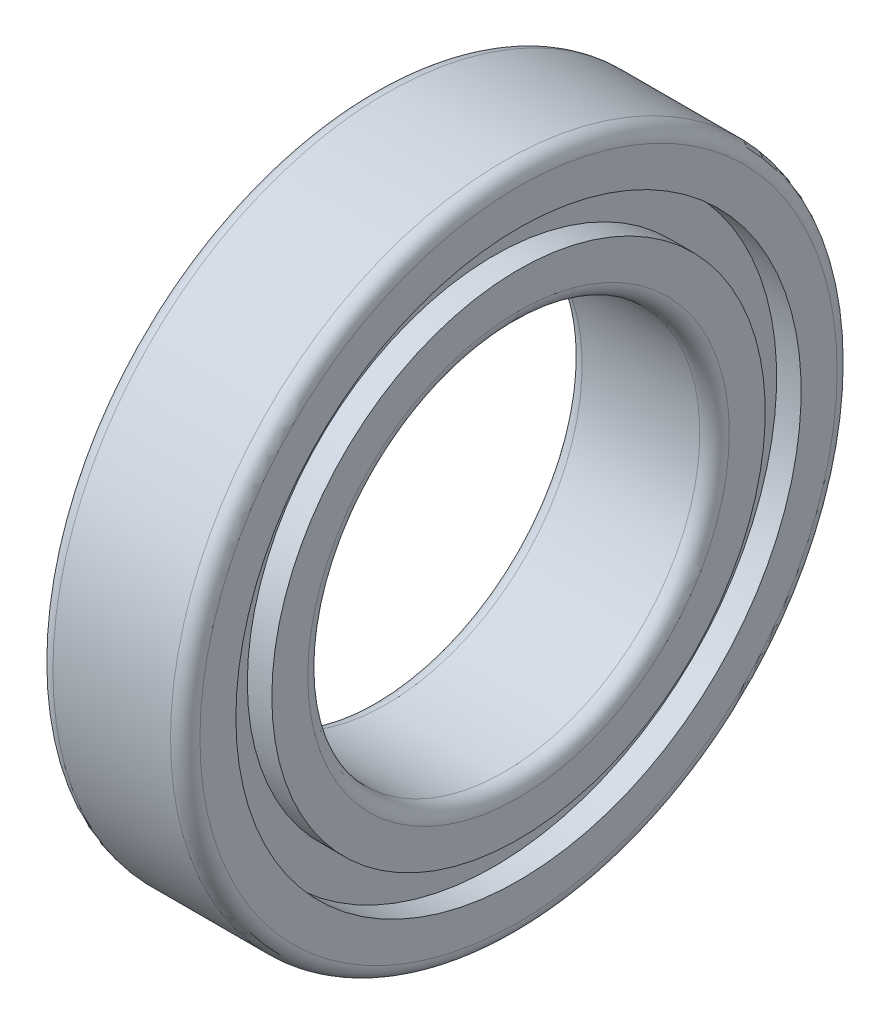
ISO-10303-21;
HEADER;
FILE_DESCRIPTION(('STEP AP214'),'2;1');
FILE_NAME('part.step','',(''),(''),'','','');
FILE_SCHEMA(('AUTOMOTIVE_DESIGN { 1 0 10303 214 1 1 1 1 }'));
ENDSEC;
DATA;
#1=APPLICATION_CONTEXT('core data for automotive mechanical design processes');
#2=APPLICATION_PROTOCOL_DEFINITION('international standard','automotive_design',2000,#1);
#3=PRODUCT_CONTEXT('',#1,'mechanical');
#4=PRODUCT('Part','Part','',(#3));
#5=PRODUCT_RELATED_PRODUCT_CATEGORY('part','',(#4));
#6=PRODUCT_DEFINITION_FORMATION('','',#4);
#7=PRODUCT_DEFINITION_CONTEXT('part definition',#1,'design');
#8=PRODUCT_DEFINITION('design','',#6,#7);
#9=PRODUCT_DEFINITION_SHAPE('','',#8);
#10=(LENGTH_UNIT() NAMED_UNIT(*) SI_UNIT(.MILLI.,.METRE.));
#11=(NAMED_UNIT(*) PLANE_ANGLE_UNIT() SI_UNIT($,.RADIAN.));
#12=(NAMED_UNIT(*) SI_UNIT($,.STERADIAN.) SOLID_ANGLE_UNIT());
#13=UNCERTAINTY_MEASURE_WITH_UNIT(LENGTH_MEASURE(1.E-05),#10,'distance_accuracy_value','');
#14=(GEOMETRIC_REPRESENTATION_CONTEXT(3) GLOBAL_UNCERTAINTY_ASSIGNED_CONTEXT((#13)) GLOBAL_UNIT_ASSIGNED_CONTEXT((#10,
#11,#12)) REPRESENTATION_CONTEXT('',''));
#15=CARTESIAN_POINT('',(0.,0.,0.));
#16=DIRECTION('',(0.,0.,1.));
#17=DIRECTION('',(1.,0.,0.));
#18=AXIS2_PLACEMENT_3D('',#15,#16,#17);
#19=CARTESIAN_POINT('',(-6.,0.,0.));
#20=DIRECTION('',(-1.,0.,0.));
#21=DIRECTION('',(0.,0.,1.));
#22=AXIS2_PLACEMENT_3D('',#19,#20,#21);
#23=TOROIDAL_SURFACE('',#22,21.5,1.5);
#24=CARTESIAN_POINT('',(-6.00000000000001,0.,0.));
#25=DIRECTION('',(-1.,0.,0.));
#26=DIRECTION('',(0.,0.,1.));
#27=AXIS2_PLACEMENT_3D('',#24,#25,#26);
#28=CIRCLE('',#27,20.);
#29=CARTESIAN_POINT('',(-6.00000000000001,0.,20.));
#30=VERTEX_POINT('',#29);
#31=EDGE_CURVE('E87',#30,#30,#28,.T.);
#32=ORIENTED_EDGE('',*,*,#31,.F.);
#33=EDGE_LOOP('',(#32));
#34=FACE_BOUND('',#33,.T.);
#35=CARTESIAN_POINT('',(-7.49999999999995,0.,0.));
#36=DIRECTION('',(-1.,0.,0.));
#37=DIRECTION('',(0.,0.,1.));
#38=AXIS2_PLACEMENT_3D('',#35,#36,#37);
#39=CIRCLE('',#38,21.5);
#40=CARTESIAN_POINT('',(-7.49999999999995,0.,21.5));
#41=VERTEX_POINT('',#40);
#42=EDGE_CURVE('E10',#41,#41,#39,.T.);
#43=ORIENTED_EDGE('',*,*,#42,.T.);
#44=EDGE_LOOP('',(#43));
#45=FACE_BOUND('',#44,.T.);
#46=ADVANCED_FACE('F35',(#34,#45),#23,.T.);
#47=CARTESIAN_POINT('',(-7.5,21.5,0.));
#48=DIRECTION('',(1.,0.,0.));
#49=DIRECTION('',(0.,0.,-1.));
#50=AXIS2_PLACEMENT_3D('',#47,#48,#49);
#51=PLANE('',#50);
#52=ORIENTED_EDGE('',*,*,#42,.F.);
#53=EDGE_LOOP('',(#52));
#54=FACE_BOUND('',#53,.T.);
#55=CARTESIAN_POINT('',(-7.49999999999995,0.,0.));
#56=DIRECTION('',(-1.,0.,0.));
#57=DIRECTION('',(0.,0.,1.));
#58=AXIS2_PLACEMENT_3D('',#55,#56,#57);
#59=CIRCLE('',#58,25.1666666666667);
#60=CARTESIAN_POINT('',(-7.49999999999995,0.,25.1666666666667));
#61=VERTEX_POINT('',#60);
#62=EDGE_CURVE('E41',#61,#61,#59,.T.);
#63=ORIENTED_EDGE('',*,*,#62,.T.);
#64=EDGE_LOOP('',(#63));
#65=FACE_BOUND('',#64,.T.);
#66=ADVANCED_FACE('F94',(#54,#65),#51,.F.);
#67=CARTESIAN_POINT('',(-1000.,0.,0.));
#68=DIRECTION('',(-1.,0.,0.));
#69=DIRECTION('',(0.,0.,1.));
#70=AXIS2_PLACEMENT_3D('',#67,#68,#69);
#71=CYLINDRICAL_SURFACE('',#70,25.1666666666667);
#72=ORIENTED_EDGE('',*,*,#62,.F.);
#73=EDGE_LOOP('',(#72));
#74=FACE_BOUND('',#73,.T.);
#75=CARTESIAN_POINT('',(-5.,0.,0.));
#76=DIRECTION('',(-1.,0.,0.));
#77=DIRECTION('',(0.,0.,1.));
#78=AXIS2_PLACEMENT_3D('',#75,#76,#77);
#79=CIRCLE('',#78,25.1666666666667);
#80=CARTESIAN_POINT('',(-5.,0.,25.1666666666667));
#81=VERTEX_POINT('',#80);
#82=EDGE_CURVE('E45',#81,#81,#79,.T.);
#83=ORIENTED_EDGE('',*,*,#82,.T.);
#84=EDGE_LOOP('',(#83));
#85=FACE_BOUND('',#84,.T.);
#86=ADVANCED_FACE('F98',(#74,#85),#71,.T.);
#87=CARTESIAN_POINT('',(-5.,25.1666666666667,0.));
#88=DIRECTION('',(1.,0.,0.));
#89=DIRECTION('',(0.,0.,-1.));
#90=AXIS2_PLACEMENT_3D('',#87,#88,#89);
#91=PLANE('',#90);
#92=ORIENTED_EDGE('',*,*,#82,.F.);
#93=EDGE_LOOP('',(#92));
#94=FACE_BOUND('',#93,.T.);
#95=CARTESIAN_POINT('',(-5.,0.,0.));
#96=DIRECTION('',(-1.,0.,0.));
#97=DIRECTION('',(0.,0.,1.));
#98=AXIS2_PLACEMENT_3D('',#95,#96,#97);
#99=CIRCLE('',#98,28.8333333333333);
#100=CARTESIAN_POINT('',(-5.,0.,28.8333333333333));
#101=VERTEX_POINT('',#100);
#102=EDGE_CURVE('E49',#101,#101,#99,.T.);
#103=ORIENTED_EDGE('',*,*,#102,.T.);
#104=EDGE_LOOP('',(#103));
#105=FACE_BOUND('',#104,.T.);
#106=ADVANCED_FACE('F103',(#94,#105),#91,.F.);
#107=CARTESIAN_POINT('',(-1000.,0.,0.));
#108=DIRECTION('',(-1.,0.,0.));
#109=DIRECTION('',(0.,0.,1.));
#110=AXIS2_PLACEMENT_3D('',#107,#108,#109);
#111=CYLINDRICAL_SURFACE('',#110,28.8333333333333);
#112=ORIENTED_EDGE('',*,*,#102,.F.);
#113=EDGE_LOOP('',(#112));
#114=FACE_BOUND('',#113,.T.);
#115=CARTESIAN_POINT('',(-7.49999999999995,0.,0.));
#116=DIRECTION('',(-1.,0.,0.));
#117=DIRECTION('',(0.,0.,1.));
#118=AXIS2_PLACEMENT_3D('',#115,#116,#117);
#119=CIRCLE('',#118,28.8333333333333);
#120=CARTESIAN_POINT('',(-7.49999999999995,0.,28.8333333333333));
#121=VERTEX_POINT('',#120);
#122=EDGE_CURVE('E54',#121,#121,#119,.T.);
#123=ORIENTED_EDGE('',*,*,#122,.T.);
#124=EDGE_LOOP('',(#123));
#125=FACE_BOUND('',#124,.T.);
#126=ADVANCED_FACE('F109',(#114,#125),#111,.F.);
#127=CARTESIAN_POINT('',(-7.5,28.8333333333333,0.));
#128=DIRECTION('',(1.,0.,0.));
#129=DIRECTION('',(0.,0.,-1.));
#130=AXIS2_PLACEMENT_3D('',#127,#128,#129);
#131=PLANE('',#130);
#132=ORIENTED_EDGE('',*,*,#122,.F.);
#133=EDGE_LOOP('',(#132));
#134=FACE_BOUND('',#133,.T.);
#135=CARTESIAN_POINT('',(-7.49999999999995,0.,0.));
#136=DIRECTION('',(-1.,0.,0.));
#137=DIRECTION('',(0.,0.,1.));
#138=AXIS2_PLACEMENT_3D('',#135,#136,#137);
#139=CIRCLE('',#138,32.5);
#140=CARTESIAN_POINT('',(-7.49999999999995,0.,32.5));
#141=VERTEX_POINT('',#140);
#142=EDGE_CURVE('E57',#141,#141,#139,.T.);
#143=ORIENTED_EDGE('',*,*,#142,.T.);
#144=EDGE_LOOP('',(#143));
#145=FACE_BOUND('',#144,.T.);
#146=ADVANCED_FACE('F113',(#134,#145),#131,.F.);
#147=CARTESIAN_POINT('',(-6.,0.,0.));
#148=DIRECTION('',(-1.,0.,0.));
#149=DIRECTION('',(0.,0.,1.));
#150=AXIS2_PLACEMENT_3D('',#147,#148,#149);
#151=TOROIDAL_SURFACE('',#150,32.5,1.5);
#152=ORIENTED_EDGE('',*,*,#142,.F.);
#153=EDGE_LOOP('',(#152));
#154=FACE_BOUND('',#153,.T.);
#155=CARTESIAN_POINT('',(-6.00000000000001,0.,0.));
#156=DIRECTION('',(-1.,0.,0.));
#157=DIRECTION('',(0.,0.,1.));
#158=AXIS2_PLACEMENT_3D('',#155,#156,#157);
#159=CIRCLE('',#158,34.);
#160=CARTESIAN_POINT('',(-6.00000000000001,0.,34.));
#161=VERTEX_POINT('',#160);
#162=EDGE_CURVE('E60',#161,#161,#159,.T.);
#163=ORIENTED_EDGE('',*,*,#162,.T.);
#164=EDGE_LOOP('',(#163));
#165=FACE_BOUND('',#164,.T.);
#166=ADVANCED_FACE('F117',(#154,#165),#151,.T.);
#167=CARTESIAN_POINT('',(-1000.,0.,0.));
#168=DIRECTION('',(-1.,0.,0.));
#169=DIRECTION('',(0.,0.,1.));
#170=AXIS2_PLACEMENT_3D('',#167,#168,#169);
#171=CYLINDRICAL_SURFACE('',#170,34.);
#172=ORIENTED_EDGE('',*,*,#162,.F.);
#173=EDGE_LOOP('',(#172));
#174=FACE_BOUND('',#173,.T.);
#175=CARTESIAN_POINT('',(6.00000000000001,0.,0.));
#176=DIRECTION('',(-1.,0.,0.));
#177=DIRECTION('',(0.,0.,1.));
#178=AXIS2_PLACEMENT_3D('',#175,#176,#177);
#179=CIRCLE('',#178,34.);
#180=CARTESIAN_POINT('',(6.00000000000001,0.,34.));
#181=VERTEX_POINT('',#180);
#182=EDGE_CURVE('E63',#181,#181,#179,.T.);
#183=ORIENTED_EDGE('',*,*,#182,.T.);
#184=EDGE_LOOP('',(#183));
#185=FACE_BOUND('',#184,.T.);
#186=ADVANCED_FACE('F121',(#174,#185),#171,.T.);
#187=CARTESIAN_POINT('',(6.,0.,0.));
#188=DIRECTION('',(-1.,0.,0.));
#189=DIRECTION('',(0.,0.,1.));
#190=AXIS2_PLACEMENT_3D('',#187,#188,#189);
#191=TOROIDAL_SURFACE('',#190,32.5,1.5);
#192=ORIENTED_EDGE('',*,*,#182,.F.);
#193=EDGE_LOOP('',(#192));
#194=FACE_BOUND('',#193,.T.);
#195=CARTESIAN_POINT('',(7.50000000000006,0.,0.));
#196=DIRECTION('',(-1.,0.,0.));
#197=DIRECTION('',(0.,0.,1.));
#198=AXIS2_PLACEMENT_3D('',#195,#196,#197);
#199=CIRCLE('',#198,32.5);
#200=CARTESIAN_POINT('',(7.50000000000006,0.,32.5));
#201=VERTEX_POINT('',#200);
#202=EDGE_CURVE('E66',#201,#201,#199,.T.);
#203=ORIENTED_EDGE('',*,*,#202,.T.);
#204=EDGE_LOOP('',(#203));
#205=FACE_BOUND('',#204,.T.);
#206=ADVANCED_FACE('F125',(#194,#205),#191,.T.);
#207=CARTESIAN_POINT('',(7.5,28.8333333333333,0.));
#208=DIRECTION('',(-1.,0.,0.));
#209=DIRECTION('',(0.,0.,1.));
#210=AXIS2_PLACEMENT_3D('',#207,#208,#209);
#211=PLANE('',#210);
#212=ORIENTED_EDGE('',*,*,#202,.F.);
#213=EDGE_LOOP('',(#212));
#214=FACE_BOUND('',#213,.T.);
#215=CARTESIAN_POINT('',(7.50000000000006,0.,0.));
#216=DIRECTION('',(-1.,0.,0.));
#217=DIRECTION('',(0.,0.,1.));
#218=AXIS2_PLACEMENT_3D('',#215,#216,#217);
#219=CIRCLE('',#218,28.8333333333333);
#220=CARTESIAN_POINT('',(7.50000000000006,0.,28.8333333333333));
#221=VERTEX_POINT('',#220);
#222=EDGE_CURVE('E69',#221,#221,#219,.T.);
#223=ORIENTED_EDGE('',*,*,#222,.T.);
#224=EDGE_LOOP('',(#223));
#225=FACE_BOUND('',#224,.T.);
#226=ADVANCED_FACE('F129',(#214,#225),#211,.F.);
#227=CARTESIAN_POINT('',(-1000.,0.,0.));
#228=DIRECTION('',(-1.,0.,0.));
#229=DIRECTION('',(0.,0.,1.));
#230=AXIS2_PLACEMENT_3D('',#227,#228,#229);
#231=CYLINDRICAL_SURFACE('',#230,28.8333333333333);
#232=ORIENTED_EDGE('',*,*,#222,.F.);
#233=EDGE_LOOP('',(#232));
#234=FACE_BOUND('',#233,.T.);
#235=CARTESIAN_POINT('',(4.99999999999989,0.,0.));
#236=DIRECTION('',(-1.,0.,0.));
#237=DIRECTION('',(0.,0.,1.));
#238=AXIS2_PLACEMENT_3D('',#235,#236,#237);
#239=CIRCLE('',#238,28.8333333333333);
#240=CARTESIAN_POINT('',(4.99999999999989,0.,28.8333333333333));
#241=VERTEX_POINT('',#240);
#242=EDGE_CURVE('E72',#241,#241,#239,.T.);
#243=ORIENTED_EDGE('',*,*,#242,.T.);
#244=EDGE_LOOP('',(#243));
#245=FACE_BOUND('',#244,.T.);
#246=ADVANCED_FACE('F133',(#234,#245),#231,.F.);
#247=CARTESIAN_POINT('',(5.,25.1666666666667,0.));
#248=DIRECTION('',(-1.,0.,0.));
#249=DIRECTION('',(0.,0.,1.));
#250=AXIS2_PLACEMENT_3D('',#247,#248,#249);
#251=PLANE('',#250);
#252=ORIENTED_EDGE('',*,*,#242,.F.);
#253=EDGE_LOOP('',(#252));
#254=FACE_BOUND('',#253,.T.);
#255=CARTESIAN_POINT('',(4.99999999999989,0.,0.));
#256=DIRECTION('',(-1.,0.,0.));
#257=DIRECTION('',(0.,0.,1.));
#258=AXIS2_PLACEMENT_3D('',#255,#256,#257);
#259=CIRCLE('',#258,25.1666666666667);
#260=CARTESIAN_POINT('',(4.99999999999989,0.,25.1666666666667));
#261=VERTEX_POINT('',#260);
#262=EDGE_CURVE('E75',#261,#261,#259,.T.);
#263=ORIENTED_EDGE('',*,*,#262,.T.);
#264=EDGE_LOOP('',(#263));
#265=FACE_BOUND('',#264,.T.);
#266=ADVANCED_FACE('F137',(#254,#265),#251,.F.);
#267=CARTESIAN_POINT('',(-1000.,0.,0.));
#268=DIRECTION('',(-1.,0.,0.));
#269=DIRECTION('',(0.,0.,1.));
#270=AXIS2_PLACEMENT_3D('',#267,#268,#269);
#271=CYLINDRICAL_SURFACE('',#270,25.1666666666667);
#272=ORIENTED_EDGE('',*,*,#262,.F.);
#273=EDGE_LOOP('',(#272));
#274=FACE_BOUND('',#273,.T.);
#275=CARTESIAN_POINT('',(7.50000000000006,0.,0.));
#276=DIRECTION('',(-1.,0.,0.));
#277=DIRECTION('',(0.,0.,1.));
#278=AXIS2_PLACEMENT_3D('',#275,#276,#277);
#279=CIRCLE('',#278,25.1666666666667);
#280=CARTESIAN_POINT('',(7.50000000000006,0.,25.1666666666667));
#281=VERTEX_POINT('',#280);
#282=EDGE_CURVE('E78',#281,#281,#279,.T.);
#283=ORIENTED_EDGE('',*,*,#282,.T.);
#284=EDGE_LOOP('',(#283));
#285=FACE_BOUND('',#284,.T.);
#286=ADVANCED_FACE('F141',(#274,#285),#271,.T.);
#287=CARTESIAN_POINT('',(7.5,21.5,0.));
#288=DIRECTION('',(-1.,0.,0.));
#289=DIRECTION('',(0.,0.,1.));
#290=AXIS2_PLACEMENT_3D('',#287,#288,#289);
#291=PLANE('',#290);
#292=ORIENTED_EDGE('',*,*,#282,.F.);
#293=EDGE_LOOP('',(#292));
#294=FACE_BOUND('',#293,.T.);
#295=CARTESIAN_POINT('',(7.50000000000006,0.,0.));
#296=DIRECTION('',(-1.,0.,0.));
#297=DIRECTION('',(0.,0.,1.));
#298=AXIS2_PLACEMENT_3D('',#295,#296,#297);
#299=CIRCLE('',#298,21.5);
#300=CARTESIAN_POINT('',(7.50000000000006,0.,21.5));
#301=VERTEX_POINT('',#300);
#302=EDGE_CURVE('E81',#301,#301,#299,.T.);
#303=ORIENTED_EDGE('',*,*,#302,.T.);
#304=EDGE_LOOP('',(#303));
#305=FACE_BOUND('',#304,.T.);
#306=ADVANCED_FACE('F145',(#294,#305),#291,.F.);
#307=CARTESIAN_POINT('',(6.,0.,0.));
#308=DIRECTION('',(-1.,0.,0.));
#309=DIRECTION('',(0.,0.,1.));
#310=AXIS2_PLACEMENT_3D('',#307,#308,#309);
#311=TOROIDAL_SURFACE('',#310,21.5,1.5);
#312=ORIENTED_EDGE('',*,*,#302,.F.);
#313=EDGE_LOOP('',(#312));
#314=FACE_BOUND('',#313,.T.);
#315=CARTESIAN_POINT('',(6.00000000000001,0.,0.));
#316=DIRECTION('',(-1.,0.,0.));
#317=DIRECTION('',(0.,0.,1.));
#318=AXIS2_PLACEMENT_3D('',#315,#316,#317);
#319=CIRCLE('',#318,20.);
#320=CARTESIAN_POINT('',(6.00000000000001,0.,20.));
#321=VERTEX_POINT('',#320);
#322=EDGE_CURVE('E84',#321,#321,#319,.T.);
#323=ORIENTED_EDGE('',*,*,#322,.T.);
#324=EDGE_LOOP('',(#323));
#325=FACE_BOUND('',#324,.T.);
#326=ADVANCED_FACE('F149',(#314,#325),#311,.T.);
#327=CARTESIAN_POINT('',(-1000.,0.,0.));
#328=DIRECTION('',(-1.,0.,0.));
#329=DIRECTION('',(0.,0.,1.));
#330=AXIS2_PLACEMENT_3D('',#327,#328,#329);
#331=CYLINDRICAL_SURFACE('',#330,20.);
#332=ORIENTED_EDGE('',*,*,#322,.F.);
#333=EDGE_LOOP('',(#332));
#334=FACE_BOUND('',#333,.T.);
#335=ORIENTED_EDGE('',*,*,#31,.T.);
#336=EDGE_LOOP('',(#335));
#337=FACE_BOUND('',#336,.T.);
#338=ADVANCED_FACE('F91',(#334,#337),#331,.F.);
#339=CLOSED_SHELL('',(#46,#66,#86,#106,#126,#146,#166,#186,#206,#226,#246,#266,#286,#306,#326,#338));
#340=MANIFOLD_SOLID_BREP('B2',#339);
#341=ADVANCED_BREP_SHAPE_REPRESENTATION('',(#18,#340),#14);
#342=SHAPE_DEFINITION_REPRESENTATION(#9,#341);
ENDSEC;
END-ISO-10303-21;
